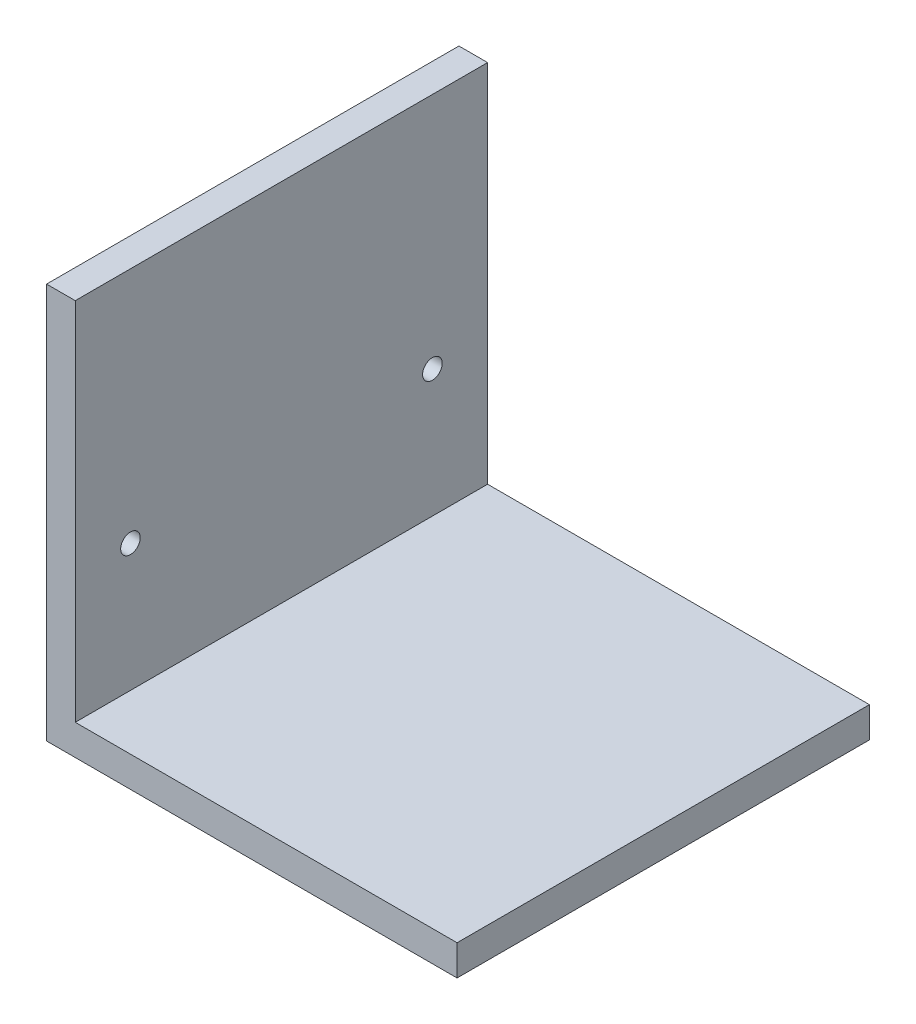
ISO-10303-21;
HEADER;
FILE_DESCRIPTION(('STEP AP214'),'2;1');
FILE_NAME('part.step','',(''),(''),'','','');
FILE_SCHEMA(('AUTOMOTIVE_DESIGN { 1 0 10303 214 1 1 1 1 }'));
ENDSEC;
DATA;
#1=APPLICATION_CONTEXT('core data for automotive mechanical design processes');
#2=APPLICATION_PROTOCOL_DEFINITION('international standard','automotive_design',2000,#1);
#3=PRODUCT_CONTEXT('',#1,'mechanical');
#4=PRODUCT('Part','Part','',(#3));
#5=PRODUCT_RELATED_PRODUCT_CATEGORY('part','',(#4));
#6=PRODUCT_DEFINITION_FORMATION('','',#4);
#7=PRODUCT_DEFINITION_CONTEXT('part definition',#1,'design');
#8=PRODUCT_DEFINITION('design','',#6,#7);
#9=PRODUCT_DEFINITION_SHAPE('','',#8);
#10=(LENGTH_UNIT() NAMED_UNIT(*) SI_UNIT(.MILLI.,.METRE.));
#11=(NAMED_UNIT(*) PLANE_ANGLE_UNIT() SI_UNIT($,.RADIAN.));
#12=(NAMED_UNIT(*) SI_UNIT($,.STERADIAN.) SOLID_ANGLE_UNIT());
#13=UNCERTAINTY_MEASURE_WITH_UNIT(LENGTH_MEASURE(1.E-05),#10,'distance_accuracy_value','');
#14=(GEOMETRIC_REPRESENTATION_CONTEXT(3) GLOBAL_UNCERTAINTY_ASSIGNED_CONTEXT((#13)) GLOBAL_UNIT_ASSIGNED_CONTEXT((#10,
#11,#12)) REPRESENTATION_CONTEXT('',''));
#15=CARTESIAN_POINT('',(0.,0.,0.));
#16=DIRECTION('',(0.,0.,1.));
#17=DIRECTION('',(1.,0.,0.));
#18=AXIS2_PLACEMENT_3D('',#15,#16,#17);
#19=CARTESIAN_POINT('',(2.93,0.,0.));
#20=DIRECTION('',(-1.,0.,0.));
#21=DIRECTION('',(0.,0.,1.));
#22=AXIS2_PLACEMENT_3D('',#19,#20,#21);
#23=PLANE('',#22);
#24=CARTESIAN_POINT('',(2.93,16.14,15.42));
#25=DIRECTION('',(-1.,0.,0.));
#26=DIRECTION('',(0.,0.,1.));
#27=AXIS2_PLACEMENT_3D('',#24,#25,#26);
#28=CIRCLE('',#27,1.);
#29=CARTESIAN_POINT('',(2.93,16.14,16.42));
#30=VERTEX_POINT('',#29);
#31=EDGE_CURVE('E125',#30,#30,#28,.T.);
#32=ORIENTED_EDGE('',*,*,#31,.T.);
#33=EDGE_LOOP('',(#32));
#34=FACE_BOUND('',#33,.T.);
#35=CARTESIAN_POINT('',(2.93,16.14,-15.42));
#36=DIRECTION('',(-1.,0.,0.));
#37=DIRECTION('',(0.,0.,1.));
#38=AXIS2_PLACEMENT_3D('',#35,#36,#37);
#39=CIRCLE('',#38,1.);
#40=CARTESIAN_POINT('',(2.93,16.14,-14.42));
#41=VERTEX_POINT('',#40);
#42=EDGE_CURVE('E233',#41,#41,#39,.T.);
#43=ORIENTED_EDGE('',*,*,#42,.T.);
#44=EDGE_LOOP('',(#43));
#45=FACE_BOUND('',#44,.T.);
#46=DIRECTION('',(0.,0.,1.));
#47=VECTOR('',#46,1.);
#48=CARTESIAN_POINT('',(2.93,3.12,21.06));
#49=LINE('',#48,#47);
#50=CARTESIAN_POINT('',(2.93,3.12,-21.06));
#51=VERTEX_POINT('',#50);
#52=CARTESIAN_POINT('',(2.93,3.12,21.06));
#53=VERTEX_POINT('',#52);
#54=EDGE_CURVE('E63',#51,#53,#49,.T.);
#55=ORIENTED_EDGE('',*,*,#54,.F.);
#56=DIRECTION('',(0.,1.,0.));
#57=VECTOR('',#56,1.);
#58=CARTESIAN_POINT('',(2.93,0.,-21.06));
#59=LINE('',#58,#57);
#60=CARTESIAN_POINT('',(2.93,40.42,-21.06));
#61=VERTEX_POINT('',#60);
#62=EDGE_CURVE('E144',#51,#61,#59,.T.);
#63=ORIENTED_EDGE('',*,*,#62,.T.);
#64=DIRECTION('',(0.,0.,1.));
#65=VECTOR('',#64,1.);
#66=CARTESIAN_POINT('',(2.93,40.42,21.06));
#67=LINE('',#66,#65);
#68=CARTESIAN_POINT('',(2.93,40.42,21.06));
#69=VERTEX_POINT('',#68);
#70=EDGE_CURVE('E147',#61,#69,#67,.T.);
#71=ORIENTED_EDGE('',*,*,#70,.T.);
#72=DIRECTION('',(0.,-1.,0.));
#73=VECTOR('',#72,1.);
#74=CARTESIAN_POINT('',(2.93,0.,21.06));
#75=LINE('',#74,#73);
#76=EDGE_CURVE('E141',#69,#53,#75,.T.);
#77=ORIENTED_EDGE('',*,*,#76,.T.);
#78=EDGE_LOOP('',(#55,#63,#71,#77));
#79=FACE_BOUND('',#78,.T.);
#80=ADVANCED_FACE('F47',(#34,#45,#79),#23,.F.);
#81=CARTESIAN_POINT('',(0.01,0.,21.06));
#82=DIRECTION('',(0.,0.,-1.));
#83=DIRECTION('',(0.,1.,0.));
#84=AXIS2_PLACEMENT_3D('',#81,#82,#83);
#85=PLANE('',#84);
#86=DIRECTION('',(0.,-1.,0.));
#87=VECTOR('',#86,1.);
#88=CARTESIAN_POINT('',(0.,0.,21.06));
#89=LINE('',#88,#87);
#90=CARTESIAN_POINT('',(0.,40.42,21.06));
#91=VERTEX_POINT('',#90);
#92=CARTESIAN_POINT('',(0.,0.,21.06));
#93=VERTEX_POINT('',#92);
#94=EDGE_CURVE('E107',#91,#93,#89,.T.);
#95=ORIENTED_EDGE('',*,*,#94,.T.);
#96=DIRECTION('',(-1.,0.,0.));
#97=VECTOR('',#96,1.);
#98=CARTESIAN_POINT('',(0.01,0.,21.06));
#99=LINE('',#98,#97);
#100=CARTESIAN_POINT('',(41.93,0.,21.06));
#101=VERTEX_POINT('',#100);
#102=EDGE_CURVE('E11',#101,#93,#99,.T.);
#103=ORIENTED_EDGE('',*,*,#102,.F.);
#104=DIRECTION('',(0.,-1.,0.));
#105=VECTOR('',#104,1.);
#106=CARTESIAN_POINT('',(41.93,0.,21.06));
#107=LINE('',#106,#105);
#108=CARTESIAN_POINT('',(41.93,3.12,21.06));
#109=VERTEX_POINT('',#108);
#110=EDGE_CURVE('E105',#109,#101,#107,.T.);
#111=ORIENTED_EDGE('',*,*,#110,.F.);
#112=DIRECTION('',(-1.,0.,0.));
#113=VECTOR('',#112,1.);
#114=CARTESIAN_POINT('',(41.93,3.12,21.06));
#115=LINE('',#114,#113);
#116=EDGE_CURVE('E133',#109,#53,#115,.T.);
#117=ORIENTED_EDGE('',*,*,#116,.T.);
#118=ORIENTED_EDGE('',*,*,#76,.F.);
#119=DIRECTION('',(-1.,0.,0.));
#120=VECTOR('',#119,1.);
#121=CARTESIAN_POINT('',(0.01,40.42,21.06));
#122=LINE('',#121,#120);
#123=EDGE_CURVE('E161',#69,#91,#122,.T.);
#124=ORIENTED_EDGE('',*,*,#123,.T.);
#125=EDGE_LOOP('',(#95,#103,#111,#117,#118,#124));
#126=FACE_BOUND('',#125,.T.);
#127=ADVANCED_FACE('F49',(#126),#85,.F.);
#128=CARTESIAN_POINT('',(0.01,0.,21.06));
#129=DIRECTION('',(0.,1.,0.));
#130=DIRECTION('',(0.,0.,1.));
#131=AXIS2_PLACEMENT_3D('',#128,#129,#130);
#132=PLANE('',#131);
#133=CARTESIAN_POINT('',(25.93,0.,0.));
#134=DIRECTION('',(0.,-1.,0.));
#135=DIRECTION('',(0.,0.,-1.));
#136=AXIS2_PLACEMENT_3D('',#133,#134,#135);
#137=CIRCLE('',#136,9.08798904693911);
#138=CARTESIAN_POINT('',(25.93,0.,-9.08798904693911));
#139=VERTEX_POINT('',#138);
#140=EDGE_CURVE('E221',#139,#139,#137,.T.);
#141=ORIENTED_EDGE('',*,*,#140,.F.);
#142=EDGE_LOOP('',(#141));
#143=FACE_BOUND('',#142,.T.);
#144=DIRECTION('',(0.,0.,-1.));
#145=VECTOR('',#144,1.);
#146=CARTESIAN_POINT('',(0.,0.,21.06));
#147=LINE('',#146,#145);
#148=CARTESIAN_POINT('',(0.,0.,-21.06));
#149=VERTEX_POINT('',#148);
#150=EDGE_CURVE('E153',#93,#149,#147,.T.);
#151=ORIENTED_EDGE('',*,*,#150,.T.);
#152=DIRECTION('',(-1.,0.,0.));
#153=VECTOR('',#152,1.);
#154=CARTESIAN_POINT('',(0.01,0.,-21.06));
#155=LINE('',#154,#153);
#156=CARTESIAN_POINT('',(41.93,0.,-21.06));
#157=VERTEX_POINT('',#156);
#158=EDGE_CURVE('E56',#157,#149,#155,.T.);
#159=ORIENTED_EDGE('',*,*,#158,.F.);
#160=DIRECTION('',(0.,0.,-1.));
#161=VECTOR('',#160,1.);
#162=CARTESIAN_POINT('',(41.93,0.,21.06));
#163=LINE('',#162,#161);
#164=EDGE_CURVE('E110',#101,#157,#163,.T.);
#165=ORIENTED_EDGE('',*,*,#164,.F.);
#166=ORIENTED_EDGE('',*,*,#102,.T.);
#167=EDGE_LOOP('',(#151,#159,#165,#166));
#168=FACE_BOUND('',#167,.T.);
#169=ADVANCED_FACE('F111',(#143,#168),#132,.F.);
#170=CARTESIAN_POINT('',(0.01,0.,-21.06));
#171=DIRECTION('',(0.,0.,1.));
#172=DIRECTION('',(1.,0.,0.));
#173=AXIS2_PLACEMENT_3D('',#170,#171,#172);
#174=PLANE('',#173);
#175=DIRECTION('',(0.,1.,0.));
#176=VECTOR('',#175,1.);
#177=CARTESIAN_POINT('',(0.,0.,-21.06));
#178=LINE('',#177,#176);
#179=CARTESIAN_POINT('',(0.,40.42,-21.06));
#180=VERTEX_POINT('',#179);
#181=EDGE_CURVE('E156',#149,#180,#178,.T.);
#182=ORIENTED_EDGE('',*,*,#181,.T.);
#183=DIRECTION('',(-1.,0.,0.));
#184=VECTOR('',#183,1.);
#185=CARTESIAN_POINT('',(0.01,40.42,-21.06));
#186=LINE('',#185,#184);
#187=EDGE_CURVE('E164',#61,#180,#186,.T.);
#188=ORIENTED_EDGE('',*,*,#187,.F.);
#189=ORIENTED_EDGE('',*,*,#62,.F.);
#190=DIRECTION('',(-1.,0.,0.));
#191=VECTOR('',#190,1.);
#192=CARTESIAN_POINT('',(41.93,3.12,-21.06));
#193=LINE('',#192,#191);
#194=CARTESIAN_POINT('',(41.93,3.12,-21.06));
#195=VERTEX_POINT('',#194);
#196=EDGE_CURVE('E137',#195,#51,#193,.T.);
#197=ORIENTED_EDGE('',*,*,#196,.F.);
#198=DIRECTION('',(0.,1.,0.));
#199=VECTOR('',#198,1.);
#200=CARTESIAN_POINT('',(41.93,0.,-21.06));
#201=LINE('',#200,#199);
#202=EDGE_CURVE('E116',#157,#195,#201,.T.);
#203=ORIENTED_EDGE('',*,*,#202,.F.);
#204=ORIENTED_EDGE('',*,*,#158,.T.);
#205=EDGE_LOOP('',(#182,#188,#189,#197,#203,#204));
#206=FACE_BOUND('',#205,.T.);
#207=ADVANCED_FACE('F169',(#206),#174,.F.);
#208=CARTESIAN_POINT('',(0.01,40.42,21.06));
#209=DIRECTION('',(0.,-1.,0.));
#210=DIRECTION('',(0.,0.,-1.));
#211=AXIS2_PLACEMENT_3D('',#208,#209,#210);
#212=PLANE('',#211);
#213=DIRECTION('',(0.,0.,1.));
#214=VECTOR('',#213,1.);
#215=CARTESIAN_POINT('',(0.,40.42,21.06));
#216=LINE('',#215,#214);
#217=EDGE_CURVE('E71',#180,#91,#216,.T.);
#218=ORIENTED_EDGE('',*,*,#217,.T.);
#219=ORIENTED_EDGE('',*,*,#123,.F.);
#220=ORIENTED_EDGE('',*,*,#70,.F.);
#221=ORIENTED_EDGE('',*,*,#187,.T.);
#222=EDGE_LOOP('',(#218,#219,#220,#221));
#223=FACE_BOUND('',#222,.T.);
#224=ADVANCED_FACE('F176',(#223),#212,.F.);
#225=CARTESIAN_POINT('',(0.,0.,0.));
#226=DIRECTION('',(-1.,0.,0.));
#227=DIRECTION('',(0.,0.,1.));
#228=AXIS2_PLACEMENT_3D('',#225,#226,#227);
#229=PLANE('',#228);
#230=CARTESIAN_POINT('',(0.,16.14,15.42));
#231=DIRECTION('',(-1.,0.,0.));
#232=DIRECTION('',(0.,0.,1.));
#233=AXIS2_PLACEMENT_3D('',#230,#231,#232);
#234=CIRCLE('',#233,1.);
#235=CARTESIAN_POINT('',(0.,16.14,16.42));
#236=VERTEX_POINT('',#235);
#237=EDGE_CURVE('E226',#236,#236,#234,.T.);
#238=ORIENTED_EDGE('',*,*,#237,.F.);
#239=EDGE_LOOP('',(#238));
#240=FACE_BOUND('',#239,.T.);
#241=CARTESIAN_POINT('',(0.,16.14,-15.42));
#242=DIRECTION('',(-1.,0.,0.));
#243=DIRECTION('',(0.,0.,-1.));
#244=AXIS2_PLACEMENT_3D('',#241,#242,#243);
#245=CIRCLE('',#244,1.);
#246=CARTESIAN_POINT('',(0.,16.14,-16.42));
#247=VERTEX_POINT('',#246);
#248=EDGE_CURVE('E220',#247,#247,#245,.T.);
#249=ORIENTED_EDGE('',*,*,#248,.F.);
#250=EDGE_LOOP('',(#249));
#251=FACE_BOUND('',#250,.T.);
#252=ORIENTED_EDGE('',*,*,#94,.F.);
#253=ORIENTED_EDGE('',*,*,#217,.F.);
#254=ORIENTED_EDGE('',*,*,#181,.F.);
#255=ORIENTED_EDGE('',*,*,#150,.F.);
#256=EDGE_LOOP('',(#252,#253,#254,#255));
#257=FACE_BOUND('',#256,.T.);
#258=ADVANCED_FACE('F173',(#240,#251,#257),#229,.T.);
#259=CARTESIAN_POINT('',(41.93,3.12,21.06));
#260=DIRECTION('',(0.,-1.,0.));
#261=DIRECTION('',(0.,0.,-1.));
#262=AXIS2_PLACEMENT_3D('',#259,#260,#261);
#263=PLANE('',#262);
#264=ORIENTED_EDGE('',*,*,#54,.T.);
#265=ORIENTED_EDGE('',*,*,#116,.F.);
#266=DIRECTION('',(0.,0.,1.));
#267=VECTOR('',#266,1.);
#268=CARTESIAN_POINT('',(41.93,3.12,21.06));
#269=LINE('',#268,#267);
#270=EDGE_CURVE('E120',#195,#109,#269,.T.);
#271=ORIENTED_EDGE('',*,*,#270,.F.);
#272=ORIENTED_EDGE('',*,*,#196,.T.);
#273=EDGE_LOOP('',(#264,#265,#271,#272));
#274=FACE_BOUND('',#273,.T.);
#275=ADVANCED_FACE('F175',(#274),#263,.F.);
#276=CARTESIAN_POINT('',(41.93,0.,0.));
#277=DIRECTION('',(-1.,0.,0.));
#278=DIRECTION('',(0.,0.,1.));
#279=AXIS2_PLACEMENT_3D('',#276,#277,#278);
#280=PLANE('',#279);
#281=ORIENTED_EDGE('',*,*,#110,.T.);
#282=ORIENTED_EDGE('',*,*,#164,.T.);
#283=ORIENTED_EDGE('',*,*,#202,.T.);
#284=ORIENTED_EDGE('',*,*,#270,.T.);
#285=EDGE_LOOP('',(#281,#282,#283,#284));
#286=FACE_BOUND('',#285,.T.);
#287=ADVANCED_FACE('F118',(#286),#280,.F.);
#288=CARTESIAN_POINT('',(41.93,16.14,-15.42));
#289=DIRECTION('',(-1.,0.,0.));
#290=DIRECTION('',(0.,0.,1.));
#291=AXIS2_PLACEMENT_3D('',#288,#289,#290);
#292=CYLINDRICAL_SURFACE('',#291,1.);
#293=ORIENTED_EDGE('',*,*,#248,.T.);
#294=EDGE_LOOP('',(#293));
#295=FACE_BOUND('',#294,.T.);
#296=ORIENTED_EDGE('',*,*,#42,.F.);
#297=EDGE_LOOP('',(#296));
#298=FACE_BOUND('',#297,.T.);
#299=ADVANCED_FACE('F199',(#295,#298),#292,.F.);
#300=CARTESIAN_POINT('',(41.93,16.14,15.42));
#301=DIRECTION('',(-1.,0.,0.));
#302=DIRECTION('',(0.,0.,1.));
#303=AXIS2_PLACEMENT_3D('',#300,#301,#302);
#304=CYLINDRICAL_SURFACE('',#303,1.);
#305=ORIENTED_EDGE('',*,*,#237,.T.);
#306=EDGE_LOOP('',(#305));
#307=FACE_BOUND('',#306,.T.);
#308=ORIENTED_EDGE('',*,*,#31,.F.);
#309=EDGE_LOOP('',(#308));
#310=FACE_BOUND('',#309,.T.);
#311=ADVANCED_FACE('F202',(#307,#310),#304,.F.);
#312=CARTESIAN_POINT('',(25.93,1.,0.));
#313=DIRECTION('',(0.,-1.,0.));
#314=DIRECTION('',(0.,0.,-1.));
#315=AXIS2_PLACEMENT_3D('',#312,#313,#314);
#316=CYLINDRICAL_SURFACE('',#315,9.08798904693911);
#317=CARTESIAN_POINT('',(25.93,1.,0.));
#318=DIRECTION('',(0.,-1.,0.));
#319=DIRECTION('',(0.,0.,-1.));
#320=AXIS2_PLACEMENT_3D('',#317,#318,#319);
#321=CIRCLE('',#320,9.08798904693911);
#322=CARTESIAN_POINT('',(25.93,1.,-9.08798904693911));
#323=VERTEX_POINT('',#322);
#324=EDGE_CURVE('E218',#323,#323,#321,.T.);
#325=ORIENTED_EDGE('',*,*,#324,.F.);
#326=EDGE_LOOP('',(#325));
#327=FACE_BOUND('',#326,.T.);
#328=ORIENTED_EDGE('',*,*,#140,.T.);
#329=EDGE_LOOP('',(#328));
#330=FACE_BOUND('',#329,.T.);
#331=ADVANCED_FACE('F206',(#327,#330),#316,.F.);
#332=CARTESIAN_POINT('',(25.93,1.,0.));
#333=DIRECTION('',(0.,-1.,0.));
#334=DIRECTION('',(0.,0.,-1.));
#335=AXIS2_PLACEMENT_3D('',#332,#333,#334);
#336=PLANE('',#335);
#337=ORIENTED_EDGE('',*,*,#324,.T.);
#338=EDGE_LOOP('',(#337));
#339=FACE_BOUND('',#338,.T.);
#340=ADVANCED_FACE('F210',(#339),#336,.T.);
#341=CLOSED_SHELL('',(#80,#127,#169,#207,#224,#258,#275,#287,#299,#311,#331,#340));
#342=MANIFOLD_SOLID_BREP('B2',#341);
#343=ADVANCED_BREP_SHAPE_REPRESENTATION('',(#18,#342),#14);
#344=SHAPE_DEFINITION_REPRESENTATION(#9,#343);
ENDSEC;
END-ISO-10303-21;
